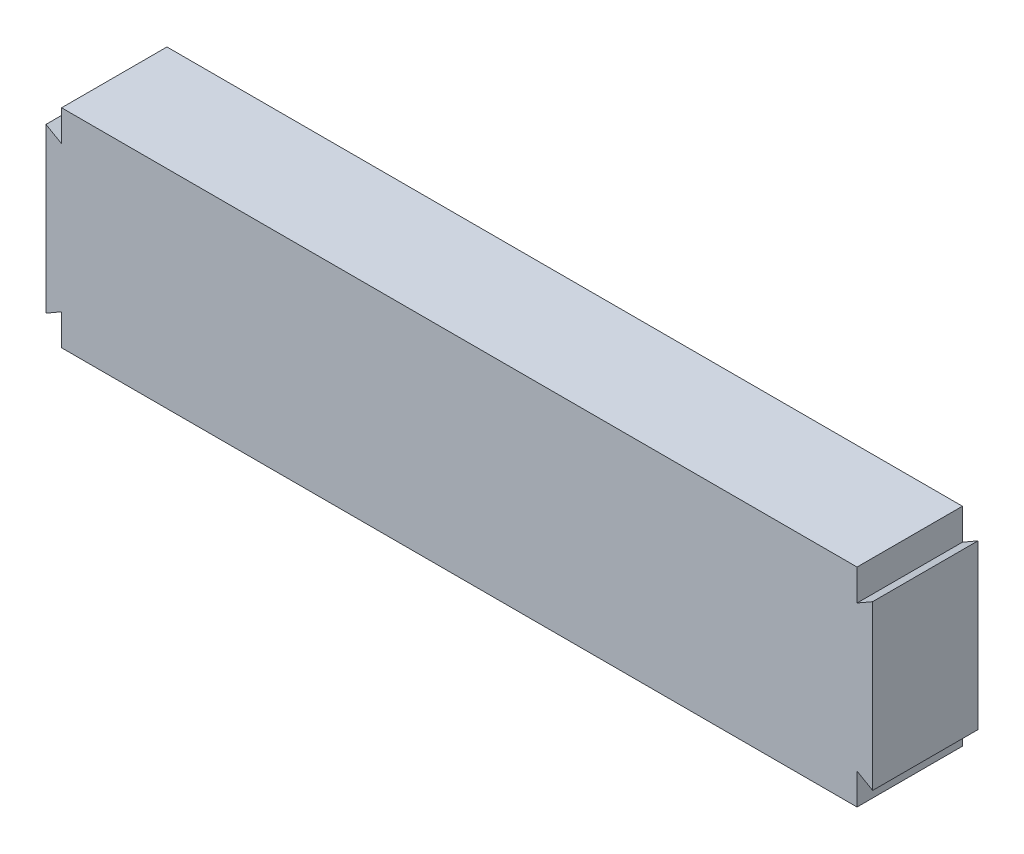
ISO-10303-21;
HEADER;
FILE_DESCRIPTION(('STEP AP214'),'2;1');
FILE_NAME('part.step','',(''),(''),'','','');
FILE_SCHEMA(('AUTOMOTIVE_DESIGN { 1 0 10303 214 1 1 1 1 }'));
ENDSEC;
DATA;
#1=APPLICATION_CONTEXT('core data for automotive mechanical design processes');
#2=APPLICATION_PROTOCOL_DEFINITION('international standard','automotive_design',2000,#1);
#3=PRODUCT_CONTEXT('',#1,'mechanical');
#4=PRODUCT('Part','Part','',(#3));
#5=PRODUCT_RELATED_PRODUCT_CATEGORY('part','',(#4));
#6=PRODUCT_DEFINITION_FORMATION('','',#4);
#7=PRODUCT_DEFINITION_CONTEXT('part definition',#1,'design');
#8=PRODUCT_DEFINITION('design','',#6,#7);
#9=PRODUCT_DEFINITION_SHAPE('','',#8);
#10=(LENGTH_UNIT() NAMED_UNIT(*) SI_UNIT(.MILLI.,.METRE.));
#11=(NAMED_UNIT(*) PLANE_ANGLE_UNIT() SI_UNIT($,.RADIAN.));
#12=(NAMED_UNIT(*) SI_UNIT($,.STERADIAN.) SOLID_ANGLE_UNIT());
#13=UNCERTAINTY_MEASURE_WITH_UNIT(LENGTH_MEASURE(1.E-05),#10,'distance_accuracy_value','');
#14=(GEOMETRIC_REPRESENTATION_CONTEXT(3) GLOBAL_UNCERTAINTY_ASSIGNED_CONTEXT((#13)) GLOBAL_UNIT_ASSIGNED_CONTEXT((#10,
#11,#12)) REPRESENTATION_CONTEXT('',''));
#15=CARTESIAN_POINT('',(0.,0.,0.));
#16=DIRECTION('',(0.,0.,1.));
#17=DIRECTION('',(1.,0.,0.));
#18=AXIS2_PLACEMENT_3D('',#15,#16,#17);
#19=CARTESIAN_POINT('',(-37.8434186666667,-16.9724,10.));
#20=DIRECTION('',(1.,0.,0.));
#21=DIRECTION('',(0.,0.,-1.));
#22=AXIS2_PLACEMENT_3D('',#19,#20,#21);
#23=PLANE('',#22);
#24=DIRECTION('',(0.,-1.,0.));
#25=VECTOR('',#24,1.);
#26=CARTESIAN_POINT('',(-37.8434186666667,-16.9724,0.));
#27=LINE('',#26,#25);
#28=CARTESIAN_POINT('',(-37.8434186666667,-16.9724,0.));
#29=VERTEX_POINT('',#28);
#30=CARTESIAN_POINT('',(-37.8434186666667,-19.932,0.));
#31=VERTEX_POINT('',#30);
#32=EDGE_CURVE('E170',#29,#31,#27,.T.);
#33=ORIENTED_EDGE('',*,*,#32,.T.);
#34=DIRECTION('',(0.,0.,-1.));
#35=VECTOR('',#34,1.);
#36=CARTESIAN_POINT('',(-37.8434186666667,-19.932,10.));
#37=LINE('',#36,#35);
#38=CARTESIAN_POINT('',(-37.8434186666667,-19.932,10.));
#39=VERTEX_POINT('',#38);
#40=EDGE_CURVE('E11',#39,#31,#37,.T.);
#41=ORIENTED_EDGE('',*,*,#40,.F.);
#42=DIRECTION('',(0.,-1.,0.));
#43=VECTOR('',#42,1.);
#44=CARTESIAN_POINT('',(-37.8434186666667,-16.9724,10.));
#45=LINE('',#44,#43);
#46=CARTESIAN_POINT('',(-37.8434186666667,-16.9724,10.));
#47=VERTEX_POINT('',#46);
#48=EDGE_CURVE('E204',#47,#39,#45,.T.);
#49=ORIENTED_EDGE('',*,*,#48,.F.);
#50=DIRECTION('',(0.,0.,-1.));
#51=VECTOR('',#50,1.);
#52=CARTESIAN_POINT('',(-37.8434186666667,-16.9724,10.));
#53=LINE('',#52,#51);
#54=EDGE_CURVE('E166',#47,#29,#53,.T.);
#55=ORIENTED_EDGE('',*,*,#54,.T.);
#56=EDGE_LOOP('',(#33,#41,#49,#55));
#57=FACE_BOUND('',#56,.T.);
#58=ADVANCED_FACE('F45',(#57),#23,.F.);
#59=CARTESIAN_POINT('',(-37.8434186666667,-19.932,10.));
#60=DIRECTION('',(0.,1.,0.));
#61=DIRECTION('',(0.,0.,1.));
#62=AXIS2_PLACEMENT_3D('',#59,#60,#61);
#63=PLANE('',#62);
#64=DIRECTION('',(1.,0.,0.));
#65=VECTOR('',#64,1.);
#66=CARTESIAN_POINT('',(-37.8434186666667,-19.932,0.));
#67=LINE('',#66,#65);
#68=CARTESIAN_POINT('',(37.6565813333333,-19.932,0.));
#69=VERTEX_POINT('',#68);
#70=EDGE_CURVE('E174',#31,#69,#67,.T.);
#71=ORIENTED_EDGE('',*,*,#70,.T.);
#72=DIRECTION('',(0.,0.,-1.));
#73=VECTOR('',#72,1.);
#74=CARTESIAN_POINT('',(37.6565813333333,-19.932,10.));
#75=LINE('',#74,#73);
#76=CARTESIAN_POINT('',(37.6565813333333,-19.932,10.));
#77=VERTEX_POINT('',#76);
#78=EDGE_CURVE('E54',#77,#69,#75,.T.);
#79=ORIENTED_EDGE('',*,*,#78,.F.);
#80=DIRECTION('',(1.,0.,0.));
#81=VECTOR('',#80,1.);
#82=CARTESIAN_POINT('',(-37.8434186666667,-19.932,10.));
#83=LINE('',#82,#81);
#84=EDGE_CURVE('E117',#39,#77,#83,.T.);
#85=ORIENTED_EDGE('',*,*,#84,.F.);
#86=ORIENTED_EDGE('',*,*,#40,.T.);
#87=EDGE_LOOP('',(#71,#79,#85,#86));
#88=FACE_BOUND('',#87,.T.);
#89=ADVANCED_FACE('F298',(#88),#63,.F.);
#90=CARTESIAN_POINT('',(37.6565813333333,-19.932,10.));
#91=DIRECTION('',(-1.,0.,0.));
#92=DIRECTION('',(0.,-1.,0.));
#93=AXIS2_PLACEMENT_3D('',#90,#91,#92);
#94=PLANE('',#93);
#95=DIRECTION('',(0.,1.,0.));
#96=VECTOR('',#95,1.);
#97=CARTESIAN_POINT('',(37.6565813333333,-19.932,0.));
#98=LINE('',#97,#96);
#99=CARTESIAN_POINT('',(37.6565813333333,-16.9724,0.));
#100=VERTEX_POINT('',#99);
#101=EDGE_CURVE('E177',#69,#100,#98,.T.);
#102=ORIENTED_EDGE('',*,*,#101,.T.);
#103=DIRECTION('',(0.,0.,-1.));
#104=VECTOR('',#103,1.);
#105=CARTESIAN_POINT('',(37.6565813333333,-16.9724,10.));
#106=LINE('',#105,#104);
#107=CARTESIAN_POINT('',(37.6565813333333,-16.9724,10.));
#108=VERTEX_POINT('',#107);
#109=EDGE_CURVE('E231',#108,#100,#106,.T.);
#110=ORIENTED_EDGE('',*,*,#109,.F.);
#111=DIRECTION('',(0.,1.,0.));
#112=VECTOR('',#111,1.);
#113=CARTESIAN_POINT('',(37.6565813333333,-19.932,10.));
#114=LINE('',#113,#112);
#115=EDGE_CURVE('E241',#77,#108,#114,.T.);
#116=ORIENTED_EDGE('',*,*,#115,.F.);
#117=ORIENTED_EDGE('',*,*,#78,.T.);
#118=EDGE_LOOP('',(#102,#110,#116,#117));
#119=FACE_BOUND('',#118,.T.);
#120=ADVANCED_FACE('F239',(#119),#94,.F.);
#121=CARTESIAN_POINT('',(37.6565813333333,-16.9724,10.));
#122=DIRECTION('',(0.500000000000004,0.866025403784436,0.));
#123=DIRECTION('',(-0.866025403784436,0.500000000000004,0.));
#124=AXIS2_PLACEMENT_3D('',#121,#122,#123);
#125=PLANE('',#124);
#126=DIRECTION('',(0.866025403784436,-0.500000000000004,0.));
#127=VECTOR('',#126,1.);
#128=CARTESIAN_POINT('',(37.6565813333333,-16.9724,0.));
#129=LINE('',#128,#127);
#130=CARTESIAN_POINT('',(39.1363813333333,-17.8267629283468,0.));
#131=VERTEX_POINT('',#130);
#132=EDGE_CURVE('E180',#100,#131,#129,.T.);
#133=ORIENTED_EDGE('',*,*,#132,.T.);
#134=DIRECTION('',(0.,0.,-1.));
#135=VECTOR('',#134,1.);
#136=CARTESIAN_POINT('',(39.1363813333333,-17.8267629283468,10.));
#137=LINE('',#136,#135);
#138=CARTESIAN_POINT('',(39.1363813333333,-17.8267629283468,10.));
#139=VERTEX_POINT('',#138);
#140=EDGE_CURVE('E227',#139,#131,#137,.T.);
#141=ORIENTED_EDGE('',*,*,#140,.F.);
#142=DIRECTION('',(0.866025403784436,-0.500000000000004,0.));
#143=VECTOR('',#142,1.);
#144=CARTESIAN_POINT('',(37.6565813333333,-16.9724,10.));
#145=LINE('',#144,#143);
#146=EDGE_CURVE('E260',#108,#139,#145,.T.);
#147=ORIENTED_EDGE('',*,*,#146,.F.);
#148=ORIENTED_EDGE('',*,*,#109,.T.);
#149=EDGE_LOOP('',(#133,#141,#147,#148));
#150=FACE_BOUND('',#149,.T.);
#151=ADVANCED_FACE('F250',(#150),#125,.F.);
#152=CARTESIAN_POINT('',(39.1363813333333,-17.8267629283468,10.));
#153=DIRECTION('',(-1.,0.,0.));
#154=DIRECTION('',(0.,0.,1.));
#155=AXIS2_PLACEMENT_3D('',#152,#153,#154);
#156=PLANE('',#155);
#157=DIRECTION('',(0.,1.,0.));
#158=VECTOR('',#157,1.);
#159=CARTESIAN_POINT('',(39.1363813333333,-17.8267629283468,0.));
#160=LINE('',#159,#158);
#161=CARTESIAN_POINT('',(39.1363813333333,-2.30657040498652,0.));
#162=VERTEX_POINT('',#161);
#163=EDGE_CURVE('E183',#131,#162,#160,.T.);
#164=ORIENTED_EDGE('',*,*,#163,.T.);
#165=DIRECTION('',(0.,0.,-1.));
#166=VECTOR('',#165,1.);
#167=CARTESIAN_POINT('',(39.1363813333333,-2.30657040498652,10.));
#168=LINE('',#167,#166);
#169=CARTESIAN_POINT('',(39.1363813333333,-2.30657040498652,10.));
#170=VERTEX_POINT('',#169);
#171=EDGE_CURVE('E223',#170,#162,#168,.T.);
#172=ORIENTED_EDGE('',*,*,#171,.F.);
#173=DIRECTION('',(0.,1.,0.));
#174=VECTOR('',#173,1.);
#175=CARTESIAN_POINT('',(39.1363813333333,-17.8267629283468,10.));
#176=LINE('',#175,#174);
#177=EDGE_CURVE('E256',#139,#170,#176,.T.);
#178=ORIENTED_EDGE('',*,*,#177,.F.);
#179=ORIENTED_EDGE('',*,*,#140,.T.);
#180=EDGE_LOOP('',(#164,#172,#178,#179));
#181=FACE_BOUND('',#180,.T.);
#182=ADVANCED_FACE('F254',(#181),#156,.F.);
#183=CARTESIAN_POINT('',(39.1363813333333,-2.30657040498652,10.));
#184=DIRECTION('',(0.5,-0.866025403784439,0.));
#185=DIRECTION('',(0.866025403784439,0.5,0.));
#186=AXIS2_PLACEMENT_3D('',#183,#184,#185);
#187=PLANE('',#186);
#188=DIRECTION('',(-0.866025403784439,-0.5,0.));
#189=VECTOR('',#188,1.);
#190=CARTESIAN_POINT('',(39.1363813333333,-2.30657040498652,0.));
#191=LINE('',#190,#189);
#192=CARTESIAN_POINT('',(37.6565813333333,-3.16093333333333,0.));
#193=VERTEX_POINT('',#192);
#194=EDGE_CURVE('E186',#162,#193,#191,.T.);
#195=ORIENTED_EDGE('',*,*,#194,.T.);
#196=DIRECTION('',(0.,0.,-1.));
#197=VECTOR('',#196,1.);
#198=CARTESIAN_POINT('',(37.6565813333333,-3.16093333333333,10.));
#199=LINE('',#198,#197);
#200=CARTESIAN_POINT('',(37.6565813333333,-3.16093333333333,10.));
#201=VERTEX_POINT('',#200);
#202=EDGE_CURVE('E219',#201,#193,#199,.T.);
#203=ORIENTED_EDGE('',*,*,#202,.F.);
#204=DIRECTION('',(-0.866025403784439,-0.5,0.));
#205=VECTOR('',#204,1.);
#206=CARTESIAN_POINT('',(39.1363813333333,-2.30657040498652,10.));
#207=LINE('',#206,#205);
#208=EDGE_CURVE('E259',#170,#201,#207,.T.);
#209=ORIENTED_EDGE('',*,*,#208,.F.);
#210=ORIENTED_EDGE('',*,*,#171,.T.);
#211=EDGE_LOOP('',(#195,#203,#209,#210));
#212=FACE_BOUND('',#211,.T.);
#213=ADVANCED_FACE('F311',(#212),#187,.F.);
#214=CARTESIAN_POINT('',(37.6565813333333,-3.16093333333333,10.));
#215=DIRECTION('',(-1.,0.,0.));
#216=DIRECTION('',(0.,0.,1.));
#217=AXIS2_PLACEMENT_3D('',#214,#215,#216);
#218=PLANE('',#217);
#219=DIRECTION('',(0.,1.,0.));
#220=VECTOR('',#219,1.);
#221=CARTESIAN_POINT('',(37.6565813333333,-3.16093333333333,0.));
#222=LINE('',#221,#220);
#223=CARTESIAN_POINT('',(37.6565813333333,-0.201333333333336,0.));
#224=VERTEX_POINT('',#223);
#225=EDGE_CURVE('E189',#193,#224,#222,.T.);
#226=ORIENTED_EDGE('',*,*,#225,.T.);
#227=DIRECTION('',(0.,0.,-1.));
#228=VECTOR('',#227,1.);
#229=CARTESIAN_POINT('',(37.6565813333333,-0.201333333333336,10.));
#230=LINE('',#229,#228);
#231=CARTESIAN_POINT('',(37.6565813333333,-0.201333333333336,10.));
#232=VERTEX_POINT('',#231);
#233=EDGE_CURVE('E215',#232,#224,#230,.T.);
#234=ORIENTED_EDGE('',*,*,#233,.F.);
#235=DIRECTION('',(0.,1.,0.));
#236=VECTOR('',#235,1.);
#237=CARTESIAN_POINT('',(37.6565813333333,-3.16093333333333,10.));
#238=LINE('',#237,#236);
#239=EDGE_CURVE('E264',#201,#232,#238,.T.);
#240=ORIENTED_EDGE('',*,*,#239,.F.);
#241=ORIENTED_EDGE('',*,*,#202,.T.);
#242=EDGE_LOOP('',(#226,#234,#240,#241));
#243=FACE_BOUND('',#242,.T.);
#244=ADVANCED_FACE('F314',(#243),#218,.F.);
#245=CARTESIAN_POINT('',(37.6565813333333,-0.201333333333336,10.));
#246=DIRECTION('',(0.,-1.,0.));
#247=DIRECTION('',(0.,0.,-1.));
#248=AXIS2_PLACEMENT_3D('',#245,#246,#247);
#249=PLANE('',#248);
#250=DIRECTION('',(-1.,0.,0.));
#251=VECTOR('',#250,1.);
#252=CARTESIAN_POINT('',(37.6565813333333,-0.201333333333336,0.));
#253=LINE('',#252,#251);
#254=CARTESIAN_POINT('',(-37.8434186666667,-0.201333333333336,0.));
#255=VERTEX_POINT('',#254);
#256=EDGE_CURVE('E192',#224,#255,#253,.T.);
#257=ORIENTED_EDGE('',*,*,#256,.T.);
#258=DIRECTION('',(0.,0.,-1.));
#259=VECTOR('',#258,1.);
#260=CARTESIAN_POINT('',(-37.8434186666667,-0.201333333333336,10.));
#261=LINE('',#260,#259);
#262=CARTESIAN_POINT('',(-37.8434186666667,-0.201333333333336,10.));
#263=VERTEX_POINT('',#262);
#264=EDGE_CURVE('E211',#263,#255,#261,.T.);
#265=ORIENTED_EDGE('',*,*,#264,.F.);
#266=DIRECTION('',(-1.,0.,0.));
#267=VECTOR('',#266,1.);
#268=CARTESIAN_POINT('',(37.6565813333333,-0.201333333333336,10.));
#269=LINE('',#268,#267);
#270=EDGE_CURVE('E271',#232,#263,#269,.T.);
#271=ORIENTED_EDGE('',*,*,#270,.F.);
#272=ORIENTED_EDGE('',*,*,#233,.T.);
#273=EDGE_LOOP('',(#257,#265,#271,#272));
#274=FACE_BOUND('',#273,.T.);
#275=ADVANCED_FACE('F279',(#274),#249,.F.);
#276=CARTESIAN_POINT('',(-37.8434186666667,-0.201333333333336,10.));
#277=DIRECTION('',(1.,0.,0.));
#278=DIRECTION('',(0.,0.,-1.));
#279=AXIS2_PLACEMENT_3D('',#276,#277,#278);
#280=PLANE('',#279);
#281=DIRECTION('',(0.,-1.,0.));
#282=VECTOR('',#281,1.);
#283=CARTESIAN_POINT('',(-37.8434186666667,-0.201333333333336,0.));
#284=LINE('',#283,#282);
#285=CARTESIAN_POINT('',(-37.8434186666667,-3.16093333333333,0.));
#286=VERTEX_POINT('',#285);
#287=EDGE_CURVE('E195',#255,#286,#284,.T.);
#288=ORIENTED_EDGE('',*,*,#287,.T.);
#289=DIRECTION('',(0.,0.,-1.));
#290=VECTOR('',#289,1.);
#291=CARTESIAN_POINT('',(-37.8434186666667,-3.16093333333333,10.));
#292=LINE('',#291,#290);
#293=CARTESIAN_POINT('',(-37.8434186666667,-3.16093333333333,10.));
#294=VERTEX_POINT('',#293);
#295=EDGE_CURVE('E159',#294,#286,#292,.T.);
#296=ORIENTED_EDGE('',*,*,#295,.F.);
#297=DIRECTION('',(0.,-1.,0.));
#298=VECTOR('',#297,1.);
#299=CARTESIAN_POINT('',(-37.8434186666667,-0.201333333333336,10.));
#300=LINE('',#299,#298);
#301=EDGE_CURVE('E148',#263,#294,#300,.T.);
#302=ORIENTED_EDGE('',*,*,#301,.F.);
#303=ORIENTED_EDGE('',*,*,#264,.T.);
#304=EDGE_LOOP('',(#288,#296,#302,#303));
#305=FACE_BOUND('',#304,.T.);
#306=ADVANCED_FACE('F283',(#305),#280,.F.);
#307=CARTESIAN_POINT('',(-37.8434186666667,-3.16093333333333,10.));
#308=DIRECTION('',(-0.500000000000001,-0.866025403784438,0.));
#309=DIRECTION('',(0.866025403784438,-0.500000000000001,0.));
#310=AXIS2_PLACEMENT_3D('',#307,#308,#309);
#311=PLANE('',#310);
#312=DIRECTION('',(-0.866025403784438,0.500000000000001,0.));
#313=VECTOR('',#312,1.);
#314=CARTESIAN_POINT('',(-37.8434186666667,-3.16093333333333,0.));
#315=LINE('',#314,#313);
#316=CARTESIAN_POINT('',(-39.3232186666667,-2.30657040498651,0.));
#317=VERTEX_POINT('',#316);
#318=EDGE_CURVE('E157',#286,#317,#315,.T.);
#319=ORIENTED_EDGE('',*,*,#318,.T.);
#320=DIRECTION('',(0.,0.,-1.));
#321=VECTOR('',#320,1.);
#322=CARTESIAN_POINT('',(-39.3232186666667,-2.30657040498651,10.));
#323=LINE('',#322,#321);
#324=CARTESIAN_POINT('',(-39.3232186666667,-2.30657040498651,10.));
#325=VERTEX_POINT('',#324);
#326=EDGE_CURVE('E154',#325,#317,#323,.T.);
#327=ORIENTED_EDGE('',*,*,#326,.F.);
#328=DIRECTION('',(-0.866025403784438,0.500000000000001,0.));
#329=VECTOR('',#328,1.);
#330=CARTESIAN_POINT('',(-37.8434186666667,-3.16093333333333,10.));
#331=LINE('',#330,#329);
#332=EDGE_CURVE('E142',#294,#325,#331,.T.);
#333=ORIENTED_EDGE('',*,*,#332,.F.);
#334=ORIENTED_EDGE('',*,*,#295,.T.);
#335=EDGE_LOOP('',(#319,#327,#333,#334));
#336=FACE_BOUND('',#335,.T.);
#337=ADVANCED_FACE('F155',(#336),#311,.F.);
#338=CARTESIAN_POINT('',(-39.3232186666667,-2.30657040498651,10.));
#339=DIRECTION('',(1.,0.,0.));
#340=DIRECTION('',(0.,0.,-1.));
#341=AXIS2_PLACEMENT_3D('',#338,#339,#340);
#342=PLANE('',#341);
#343=DIRECTION('',(0.,-1.,0.));
#344=VECTOR('',#343,1.);
#345=CARTESIAN_POINT('',(-39.3232186666667,-2.30657040498651,0.));
#346=LINE('',#345,#344);
#347=CARTESIAN_POINT('',(-39.3232186666667,-17.8267629283468,0.));
#348=VERTEX_POINT('',#347);
#349=EDGE_CURVE('E103',#317,#348,#346,.T.);
#350=ORIENTED_EDGE('',*,*,#349,.T.);
#351=DIRECTION('',(0.,0.,-1.));
#352=VECTOR('',#351,1.);
#353=CARTESIAN_POINT('',(-39.3232186666667,-17.8267629283468,10.));
#354=LINE('',#353,#352);
#355=CARTESIAN_POINT('',(-39.3232186666667,-17.8267629283468,10.));
#356=VERTEX_POINT('',#355);
#357=EDGE_CURVE('E160',#356,#348,#354,.T.);
#358=ORIENTED_EDGE('',*,*,#357,.F.);
#359=DIRECTION('',(0.,-1.,0.));
#360=VECTOR('',#359,1.);
#361=CARTESIAN_POINT('',(-39.3232186666667,-2.30657040498651,10.));
#362=LINE('',#361,#360);
#363=EDGE_CURVE('E146',#325,#356,#362,.T.);
#364=ORIENTED_EDGE('',*,*,#363,.F.);
#365=ORIENTED_EDGE('',*,*,#326,.T.);
#366=EDGE_LOOP('',(#350,#358,#364,#365));
#367=FACE_BOUND('',#366,.T.);
#368=ADVANCED_FACE('F162',(#367),#342,.F.);
#369=CARTESIAN_POINT('',(-39.3232186666667,-17.8267629283468,10.));
#370=DIRECTION('',(-0.5,0.866025403784439,0.));
#371=DIRECTION('',(-0.866025403784439,-0.5,0.));
#372=AXIS2_PLACEMENT_3D('',#369,#370,#371);
#373=PLANE('',#372);
#374=DIRECTION('',(0.866025403784439,0.5,0.));
#375=VECTOR('',#374,1.);
#376=CARTESIAN_POINT('',(-39.3232186666667,-17.8267629283468,0.));
#377=LINE('',#376,#375);
#378=EDGE_CURVE('E109',#348,#29,#377,.T.);
#379=ORIENTED_EDGE('',*,*,#378,.T.);
#380=ORIENTED_EDGE('',*,*,#54,.F.);
#381=DIRECTION('',(0.866025403784439,0.5,0.));
#382=VECTOR('',#381,1.);
#383=CARTESIAN_POINT('',(-39.3232186666667,-17.8267629283468,10.));
#384=LINE('',#383,#382);
#385=EDGE_CURVE('E62',#356,#47,#384,.T.);
#386=ORIENTED_EDGE('',*,*,#385,.F.);
#387=ORIENTED_EDGE('',*,*,#357,.T.);
#388=EDGE_LOOP('',(#379,#380,#386,#387));
#389=FACE_BOUND('',#388,.T.);
#390=ADVANCED_FACE('F287',(#389),#373,.F.);
#391=CARTESIAN_POINT('',(0.,0.,10.));
#392=DIRECTION('',(0.,0.,1.));
#393=DIRECTION('',(1.,0.,0.));
#394=AXIS2_PLACEMENT_3D('',#391,#392,#393);
#395=PLANE('',#394);
#396=ORIENTED_EDGE('',*,*,#48,.T.);
#397=ORIENTED_EDGE('',*,*,#84,.T.);
#398=ORIENTED_EDGE('',*,*,#115,.T.);
#399=ORIENTED_EDGE('',*,*,#146,.T.);
#400=ORIENTED_EDGE('',*,*,#177,.T.);
#401=ORIENTED_EDGE('',*,*,#208,.T.);
#402=ORIENTED_EDGE('',*,*,#239,.T.);
#403=ORIENTED_EDGE('',*,*,#270,.T.);
#404=ORIENTED_EDGE('',*,*,#301,.T.);
#405=ORIENTED_EDGE('',*,*,#332,.T.);
#406=ORIENTED_EDGE('',*,*,#363,.T.);
#407=ORIENTED_EDGE('',*,*,#385,.T.);
#408=EDGE_LOOP('',(#396,#397,#398,#399,#400,#401,#402,#403,#404,#405,#406,#407));
#409=FACE_BOUND('',#408,.T.);
#410=ADVANCED_FACE('F144',(#409),#395,.T.);
#411=CARTESIAN_POINT('',(0.,0.,0.));
#412=DIRECTION('',(0.,0.,1.));
#413=DIRECTION('',(1.,0.,0.));
#414=AXIS2_PLACEMENT_3D('',#411,#412,#413);
#415=PLANE('',#414);
#416=ORIENTED_EDGE('',*,*,#32,.F.);
#417=ORIENTED_EDGE('',*,*,#378,.F.);
#418=ORIENTED_EDGE('',*,*,#349,.F.);
#419=ORIENTED_EDGE('',*,*,#318,.F.);
#420=ORIENTED_EDGE('',*,*,#287,.F.);
#421=ORIENTED_EDGE('',*,*,#256,.F.);
#422=ORIENTED_EDGE('',*,*,#225,.F.);
#423=ORIENTED_EDGE('',*,*,#194,.F.);
#424=ORIENTED_EDGE('',*,*,#163,.F.);
#425=ORIENTED_EDGE('',*,*,#132,.F.);
#426=ORIENTED_EDGE('',*,*,#101,.F.);
#427=ORIENTED_EDGE('',*,*,#70,.F.);
#428=EDGE_LOOP('',(#416,#417,#418,#419,#420,#421,#422,#423,#424,#425,#426,#427));
#429=FACE_BOUND('',#428,.T.);
#430=ADVANCED_FACE('F245',(#429),#415,.F.);
#431=CLOSED_SHELL('',(#58,#89,#120,#151,#182,#213,#244,#275,#306,#337,#368,#390,#410,#430));
#432=MANIFOLD_SOLID_BREP('B2',#431);
#433=ADVANCED_BREP_SHAPE_REPRESENTATION('',(#18,#432),#14);
#434=SHAPE_DEFINITION_REPRESENTATION(#9,#433);
ENDSEC;
END-ISO-10303-21;
